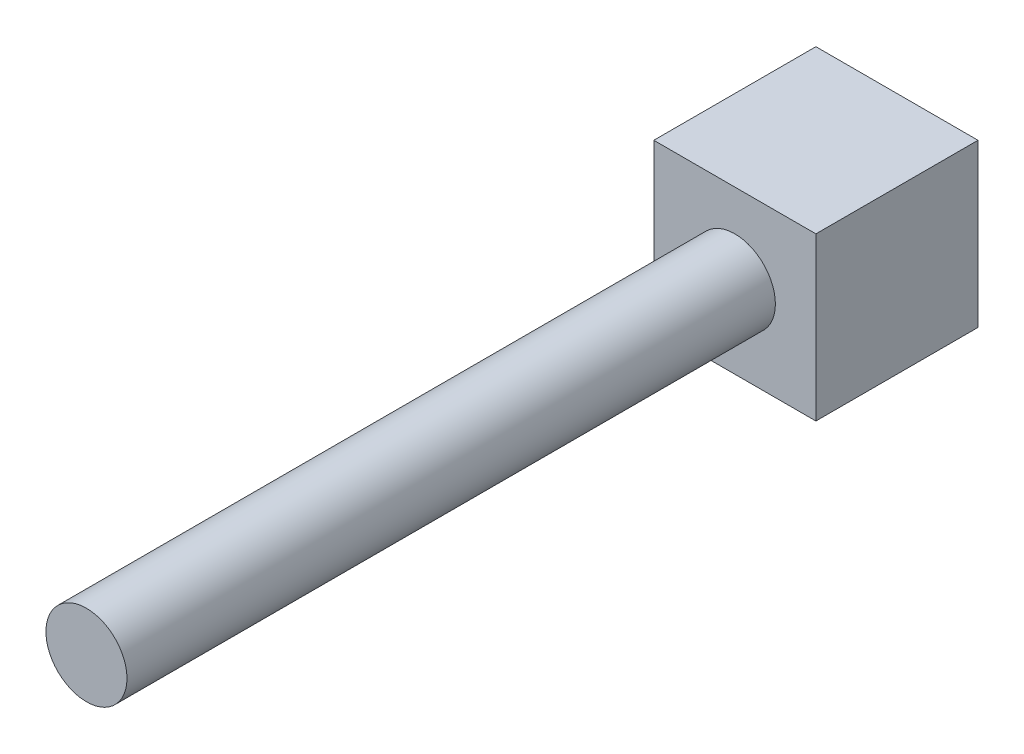
ISO-10303-21;
HEADER;
FILE_DESCRIPTION(('STEP AP214'),'2;1');
FILE_NAME('part.step','',(''),(''),'','','');
FILE_SCHEMA(('AUTOMOTIVE_DESIGN { 1 0 10303 214 1 1 1 1 }'));
ENDSEC;
DATA;
#1=APPLICATION_CONTEXT('core data for automotive mechanical design processes');
#2=APPLICATION_PROTOCOL_DEFINITION('international standard','automotive_design',2000,#1);
#3=PRODUCT_CONTEXT('',#1,'mechanical');
#4=PRODUCT('Part','Part','',(#3));
#5=PRODUCT_RELATED_PRODUCT_CATEGORY('part','',(#4));
#6=PRODUCT_DEFINITION_FORMATION('','',#4);
#7=PRODUCT_DEFINITION_CONTEXT('part definition',#1,'design');
#8=PRODUCT_DEFINITION('design','',#6,#7);
#9=PRODUCT_DEFINITION_SHAPE('','',#8);
#10=(LENGTH_UNIT() NAMED_UNIT(*) SI_UNIT(.MILLI.,.METRE.));
#11=(NAMED_UNIT(*) PLANE_ANGLE_UNIT() SI_UNIT($,.RADIAN.));
#12=(NAMED_UNIT(*) SI_UNIT($,.STERADIAN.) SOLID_ANGLE_UNIT());
#13=UNCERTAINTY_MEASURE_WITH_UNIT(LENGTH_MEASURE(1.E-05),#10,'distance_accuracy_value','');
#14=(GEOMETRIC_REPRESENTATION_CONTEXT(3) GLOBAL_UNCERTAINTY_ASSIGNED_CONTEXT((#13)) GLOBAL_UNIT_ASSIGNED_CONTEXT((#10,
#11,#12)) REPRESENTATION_CONTEXT('',''));
#15=CARTESIAN_POINT('',(0.,0.,0.));
#16=DIRECTION('',(0.,0.,1.));
#17=DIRECTION('',(1.,0.,0.));
#18=AXIS2_PLACEMENT_3D('',#15,#16,#17);
#19=CARTESIAN_POINT('',(5.,-5.,10.));
#20=DIRECTION('',(-1.,0.,0.));
#21=DIRECTION('',(0.,0.,1.));
#22=AXIS2_PLACEMENT_3D('',#19,#20,#21);
#23=PLANE('',#22);
#24=DIRECTION('',(0.,1.,0.));
#25=VECTOR('',#24,1.);
#26=CARTESIAN_POINT('',(5.,-5.,0.));
#27=LINE('',#26,#25);
#28=CARTESIAN_POINT('',(5.,-5.,0.));
#29=VERTEX_POINT('',#28);
#30=CARTESIAN_POINT('',(5.,5.,0.));
#31=VERTEX_POINT('',#30);
#32=EDGE_CURVE('E110',#29,#31,#27,.T.);
#33=ORIENTED_EDGE('',*,*,#32,.T.);
#34=DIRECTION('',(0.,0.,-1.));
#35=VECTOR('',#34,1.);
#36=CARTESIAN_POINT('',(5.,5.,10.));
#37=LINE('',#36,#35);
#38=CARTESIAN_POINT('',(5.,5.,10.));
#39=VERTEX_POINT('',#38);
#40=EDGE_CURVE('E42',#39,#31,#37,.T.);
#41=ORIENTED_EDGE('',*,*,#40,.F.);
#42=DIRECTION('',(0.,1.,0.));
#43=VECTOR('',#42,1.);
#44=CARTESIAN_POINT('',(5.,-5.,10.));
#45=LINE('',#44,#43);
#46=CARTESIAN_POINT('',(5.,-5.,10.));
#47=VERTEX_POINT('',#46);
#48=EDGE_CURVE('E93',#47,#39,#45,.T.);
#49=ORIENTED_EDGE('',*,*,#48,.F.);
#50=DIRECTION('',(0.,0.,-1.));
#51=VECTOR('',#50,1.);
#52=CARTESIAN_POINT('',(5.,-5.,10.));
#53=LINE('',#52,#51);
#54=EDGE_CURVE('E106',#47,#29,#53,.T.);
#55=ORIENTED_EDGE('',*,*,#54,.T.);
#56=EDGE_LOOP('',(#33,#41,#49,#55));
#57=FACE_BOUND('',#56,.T.);
#58=ADVANCED_FACE('F39',(#57),#23,.F.);
#59=CARTESIAN_POINT('',(-5.,5.,10.));
#60=DIRECTION('',(0.,-1.,0.));
#61=DIRECTION('',(0.,0.,-1.));
#62=AXIS2_PLACEMENT_3D('',#59,#60,#61);
#63=PLANE('',#62);
#64=DIRECTION('',(-1.,0.,0.));
#65=VECTOR('',#64,1.);
#66=CARTESIAN_POINT('',(-5.,5.,0.));
#67=LINE('',#66,#65);
#68=CARTESIAN_POINT('',(-5.,5.,0.));
#69=VERTEX_POINT('',#68);
#70=EDGE_CURVE('E99',#31,#69,#67,.T.);
#71=ORIENTED_EDGE('',*,*,#70,.T.);
#72=DIRECTION('',(0.,0.,-1.));
#73=VECTOR('',#72,1.);
#74=CARTESIAN_POINT('',(-5.,5.,10.));
#75=LINE('',#74,#73);
#76=CARTESIAN_POINT('',(-5.,5.,10.));
#77=VERTEX_POINT('',#76);
#78=EDGE_CURVE('E97',#77,#69,#75,.T.);
#79=ORIENTED_EDGE('',*,*,#78,.F.);
#80=DIRECTION('',(-1.,0.,0.));
#81=VECTOR('',#80,1.);
#82=CARTESIAN_POINT('',(-5.,5.,10.));
#83=LINE('',#82,#81);
#84=EDGE_CURVE('E88',#39,#77,#83,.T.);
#85=ORIENTED_EDGE('',*,*,#84,.F.);
#86=ORIENTED_EDGE('',*,*,#40,.T.);
#87=EDGE_LOOP('',(#71,#79,#85,#86));
#88=FACE_BOUND('',#87,.T.);
#89=ADVANCED_FACE('F98',(#88),#63,.F.);
#90=CARTESIAN_POINT('',(-5.,-5.,10.));
#91=DIRECTION('',(1.,0.,0.));
#92=DIRECTION('',(0.,0.,-1.));
#93=AXIS2_PLACEMENT_3D('',#90,#91,#92);
#94=PLANE('',#93);
#95=DIRECTION('',(0.,-1.,0.));
#96=VECTOR('',#95,1.);
#97=CARTESIAN_POINT('',(-5.,-5.,0.));
#98=LINE('',#97,#96);
#99=CARTESIAN_POINT('',(-5.,-5.,0.));
#100=VERTEX_POINT('',#99);
#101=EDGE_CURVE('E74',#69,#100,#98,.T.);
#102=ORIENTED_EDGE('',*,*,#101,.T.);
#103=DIRECTION('',(0.,0.,-1.));
#104=VECTOR('',#103,1.);
#105=CARTESIAN_POINT('',(-5.,-5.,10.));
#106=LINE('',#105,#104);
#107=CARTESIAN_POINT('',(-5.,-5.,10.));
#108=VERTEX_POINT('',#107);
#109=EDGE_CURVE('E101',#108,#100,#106,.T.);
#110=ORIENTED_EDGE('',*,*,#109,.F.);
#111=DIRECTION('',(0.,-1.,0.));
#112=VECTOR('',#111,1.);
#113=CARTESIAN_POINT('',(-5.,-5.,10.));
#114=LINE('',#113,#112);
#115=EDGE_CURVE('E91',#77,#108,#114,.T.);
#116=ORIENTED_EDGE('',*,*,#115,.F.);
#117=ORIENTED_EDGE('',*,*,#78,.T.);
#118=EDGE_LOOP('',(#102,#110,#116,#117));
#119=FACE_BOUND('',#118,.T.);
#120=ADVANCED_FACE('F102',(#119),#94,.F.);
#121=CARTESIAN_POINT('',(-5.,-5.,10.));
#122=DIRECTION('',(0.,1.,0.));
#123=DIRECTION('',(0.,0.,1.));
#124=AXIS2_PLACEMENT_3D('',#121,#122,#123);
#125=PLANE('',#124);
#126=DIRECTION('',(1.,0.,0.));
#127=VECTOR('',#126,1.);
#128=CARTESIAN_POINT('',(-5.,-5.,0.));
#129=LINE('',#128,#127);
#130=EDGE_CURVE('E80',#100,#29,#129,.T.);
#131=ORIENTED_EDGE('',*,*,#130,.T.);
#132=ORIENTED_EDGE('',*,*,#54,.F.);
#133=DIRECTION('',(1.,0.,0.));
#134=VECTOR('',#133,1.);
#135=CARTESIAN_POINT('',(-5.,-5.,10.));
#136=LINE('',#135,#134);
#137=EDGE_CURVE('E57',#108,#47,#136,.T.);
#138=ORIENTED_EDGE('',*,*,#137,.F.);
#139=ORIENTED_EDGE('',*,*,#109,.T.);
#140=EDGE_LOOP('',(#131,#132,#138,#139));
#141=FACE_BOUND('',#140,.T.);
#142=ADVANCED_FACE('F124',(#141),#125,.F.);
#143=CARTESIAN_POINT('',(0.,0.,10.));
#144=DIRECTION('',(0.,0.,-1.));
#145=DIRECTION('',(-1.,0.,0.));
#146=AXIS2_PLACEMENT_3D('',#143,#144,#145);
#147=PLANE('',#146);
#148=CARTESIAN_POINT('',(0.,0.,10.));
#149=DIRECTION('',(0.,0.,1.));
#150=DIRECTION('',(1.,0.,0.));
#151=AXIS2_PLACEMENT_3D('',#148,#149,#150);
#152=CIRCLE('',#151,2.5);
#153=CARTESIAN_POINT('',(2.5,0.,10.));
#154=VERTEX_POINT('',#153);
#155=EDGE_CURVE('E11',#154,#154,#152,.T.);
#156=ORIENTED_EDGE('',*,*,#155,.F.);
#157=EDGE_LOOP('',(#156));
#158=FACE_BOUND('',#157,.T.);
#159=ORIENTED_EDGE('',*,*,#48,.T.);
#160=ORIENTED_EDGE('',*,*,#84,.T.);
#161=ORIENTED_EDGE('',*,*,#115,.T.);
#162=ORIENTED_EDGE('',*,*,#137,.T.);
#163=EDGE_LOOP('',(#159,#160,#161,#162));
#164=FACE_BOUND('',#163,.T.);
#165=ADVANCED_FACE('F89',(#158,#164),#147,.F.);
#166=CARTESIAN_POINT('',(0.,0.,0.));
#167=DIRECTION('',(0.,0.,-1.));
#168=DIRECTION('',(-1.,0.,0.));
#169=AXIS2_PLACEMENT_3D('',#166,#167,#168);
#170=PLANE('',#169);
#171=ORIENTED_EDGE('',*,*,#32,.F.);
#172=ORIENTED_EDGE('',*,*,#130,.F.);
#173=ORIENTED_EDGE('',*,*,#101,.F.);
#174=ORIENTED_EDGE('',*,*,#70,.F.);
#175=EDGE_LOOP('',(#171,#172,#173,#174));
#176=FACE_BOUND('',#175,.T.);
#177=ADVANCED_FACE('F127',(#176),#170,.T.);
#178=CARTESIAN_POINT('',(0.,0.,50.));
#179=DIRECTION('',(0.,0.,-1.));
#180=DIRECTION('',(-1.,0.,0.));
#181=AXIS2_PLACEMENT_3D('',#178,#179,#180);
#182=CYLINDRICAL_SURFACE('',#181,2.5);
#183=CARTESIAN_POINT('',(0.,0.,50.));
#184=DIRECTION('',(0.,0.,1.));
#185=DIRECTION('',(1.,0.,0.));
#186=AXIS2_PLACEMENT_3D('',#183,#184,#185);
#187=CIRCLE('',#186,2.5);
#188=CARTESIAN_POINT('',(2.5,0.,50.));
#189=VERTEX_POINT('',#188);
#190=EDGE_CURVE('E114',#189,#189,#187,.T.);
#191=ORIENTED_EDGE('',*,*,#190,.F.);
#192=EDGE_LOOP('',(#191));
#193=FACE_BOUND('',#192,.T.);
#194=ORIENTED_EDGE('',*,*,#155,.T.);
#195=EDGE_LOOP('',(#194));
#196=FACE_BOUND('',#195,.T.);
#197=ADVANCED_FACE('F137',(#193,#196),#182,.T.);
#198=CARTESIAN_POINT('',(0.,0.,50.));
#199=DIRECTION('',(0.,0.,1.));
#200=DIRECTION('',(1.,0.,0.));
#201=AXIS2_PLACEMENT_3D('',#198,#199,#200);
#202=PLANE('',#201);
#203=ORIENTED_EDGE('',*,*,#190,.T.);
#204=EDGE_LOOP('',(#203));
#205=FACE_BOUND('',#204,.T.);
#206=ADVANCED_FACE('F135',(#205),#202,.T.);
#207=CLOSED_SHELL('',(#58,#89,#120,#142,#165,#177,#197,#206));
#208=MANIFOLD_SOLID_BREP('B2',#207);
#209=ADVANCED_BREP_SHAPE_REPRESENTATION('',(#18,#208),#14);
#210=SHAPE_DEFINITION_REPRESENTATION(#9,#209);
ENDSEC;
END-ISO-10303-21;
